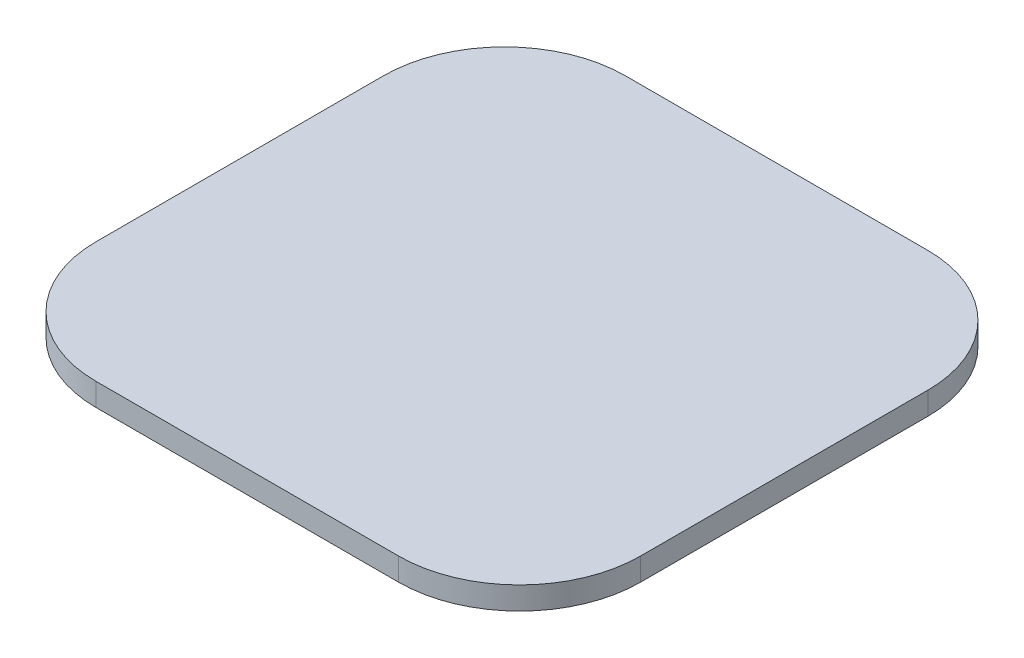
ISO-10303-21;
HEADER;
FILE_DESCRIPTION(('STEP AP214'),'2;1');
FILE_NAME('part.step','',(''),(''),'','','');
FILE_SCHEMA(('AUTOMOTIVE_DESIGN { 1 0 10303 214 1 1 1 1 }'));
ENDSEC;
DATA;
#1=APPLICATION_CONTEXT('core data for automotive mechanical design processes');
#2=APPLICATION_PROTOCOL_DEFINITION('international standard','automotive_design',2000,#1);
#3=PRODUCT_CONTEXT('',#1,'mechanical');
#4=PRODUCT('Part','Part','',(#3));
#5=PRODUCT_RELATED_PRODUCT_CATEGORY('part','',(#4));
#6=PRODUCT_DEFINITION_FORMATION('','',#4);
#7=PRODUCT_DEFINITION_CONTEXT('part definition',#1,'design');
#8=PRODUCT_DEFINITION('design','',#6,#7);
#9=PRODUCT_DEFINITION_SHAPE('','',#8);
#10=(LENGTH_UNIT() NAMED_UNIT(*) SI_UNIT(.MILLI.,.METRE.));
#11=(NAMED_UNIT(*) PLANE_ANGLE_UNIT() SI_UNIT($,.RADIAN.));
#12=(NAMED_UNIT(*) SI_UNIT($,.STERADIAN.) SOLID_ANGLE_UNIT());
#13=UNCERTAINTY_MEASURE_WITH_UNIT(LENGTH_MEASURE(1.E-05),#10,'distance_accuracy_value','');
#14=(GEOMETRIC_REPRESENTATION_CONTEXT(3) GLOBAL_UNCERTAINTY_ASSIGNED_CONTEXT((#13)) GLOBAL_UNIT_ASSIGNED_CONTEXT((#10,
#11,#12)) REPRESENTATION_CONTEXT('',''));
#15=CARTESIAN_POINT('',(0.,0.,0.));
#16=DIRECTION('',(0.,0.,1.));
#17=DIRECTION('',(1.,0.,0.));
#18=AXIS2_PLACEMENT_3D('',#15,#16,#17);
#19=CARTESIAN_POINT('',(0.,-7.5,0.));
#20=DIRECTION('',(0.,-1.,0.));
#21=DIRECTION('',(0.,0.,-1.));
#22=AXIS2_PLACEMENT_3D('',#19,#20,#21);
#23=PLANE('',#22);
#24=CARTESIAN_POINT('',(50.,-7.5,-4.99999999999996));
#25=DIRECTION('',(0.,1.,0.));
#26=DIRECTION('',(0.,0.,1.));
#27=AXIS2_PLACEMENT_3D('',#24,#25,#26);
#28=CIRCLE('',#27,40.);
#29=CARTESIAN_POINT('',(90.,-7.5,-4.99999999999996));
#30=VERTEX_POINT('',#29);
#31=CARTESIAN_POINT('',(49.9999999999999,-7.5,-45.));
#32=VERTEX_POINT('',#31);
#33=EDGE_CURVE('E11',#30,#32,#28,.T.);
#34=ORIENTED_EDGE('',*,*,#33,.T.);
#35=DIRECTION('',(1.,0.,0.));
#36=VECTOR('',#35,1.);
#37=CARTESIAN_POINT('',(-90.,-7.5,-44.9999999999999));
#38=LINE('',#37,#36);
#39=CARTESIAN_POINT('',(-50.,-7.5,-44.9999999999999));
#40=VERTEX_POINT('',#39);
#41=EDGE_CURVE('E136',#40,#32,#38,.T.);
#42=ORIENTED_EDGE('',*,*,#41,.F.);
#43=CARTESIAN_POINT('',(-50.,-7.5,-4.99999999999995));
#44=DIRECTION('',(0.,1.,0.));
#45=DIRECTION('',(0.,0.,1.));
#46=AXIS2_PLACEMENT_3D('',#43,#44,#45);
#47=CIRCLE('',#46,40.);
#48=CARTESIAN_POINT('',(-90.,-7.5,-4.99999999999994));
#49=VERTEX_POINT('',#48);
#50=EDGE_CURVE('E43',#40,#49,#47,.T.);
#51=ORIENTED_EDGE('',*,*,#50,.T.);
#52=DIRECTION('',(0.,0.,-1.));
#53=VECTOR('',#52,1.);
#54=CARTESIAN_POINT('',(-90.,-7.5,90.0000000000001));
#55=LINE('',#54,#53);
#56=CARTESIAN_POINT('',(-90.,-7.5,90.0000000000001));
#57=VERTEX_POINT('',#56);
#58=EDGE_CURVE('E57',#57,#49,#55,.T.);
#59=ORIENTED_EDGE('',*,*,#58,.F.);
#60=CARTESIAN_POINT('',(-50.,-7.5,90.0000000000001));
#61=DIRECTION('',(0.,-1.,0.));
#62=DIRECTION('',(0.,0.,-1.));
#63=AXIS2_PLACEMENT_3D('',#60,#61,#62);
#64=CIRCLE('',#63,40.);
#65=CARTESIAN_POINT('',(-50.,-7.5,130.));
#66=VERTEX_POINT('',#65);
#67=EDGE_CURVE('E154',#66,#57,#64,.T.);
#68=ORIENTED_EDGE('',*,*,#67,.F.);
#69=DIRECTION('',(-1.,0.,0.));
#70=VECTOR('',#69,1.);
#71=CARTESIAN_POINT('',(50.,-7.5,130.));
#72=LINE('',#71,#70);
#73=CARTESIAN_POINT('',(50.,-7.5,130.));
#74=VERTEX_POINT('',#73);
#75=EDGE_CURVE('E157',#74,#66,#72,.T.);
#76=ORIENTED_EDGE('',*,*,#75,.F.);
#77=CARTESIAN_POINT('',(50.,-7.5,90.0000000000001));
#78=DIRECTION('',(0.,-1.,0.));
#79=DIRECTION('',(0.,0.,-1.));
#80=AXIS2_PLACEMENT_3D('',#77,#78,#79);
#81=CIRCLE('',#80,40.);
#82=CARTESIAN_POINT('',(90.,-7.5,90.0000000000001));
#83=VERTEX_POINT('',#82);
#84=EDGE_CURVE('E106',#83,#74,#81,.T.);
#85=ORIENTED_EDGE('',*,*,#84,.F.);
#86=DIRECTION('',(0.,0.,1.));
#87=VECTOR('',#86,1.);
#88=CARTESIAN_POINT('',(90.,-7.5,-89.9999999999999));
#89=LINE('',#88,#87);
#90=EDGE_CURVE('E38',#30,#83,#89,.T.);
#91=ORIENTED_EDGE('',*,*,#90,.F.);
#92=EDGE_LOOP('',(#34,#42,#51,#59,#68,#76,#85,#91));
#93=FACE_BOUND('',#92,.T.);
#94=ADVANCED_FACE('F34',(#93),#23,.F.);
#95=CARTESIAN_POINT('',(-90.,-7.5,90.0000000000001));
#96=DIRECTION('',(1.,0.,0.));
#97=DIRECTION('',(0.,0.,-1.));
#98=AXIS2_PLACEMENT_3D('',#95,#96,#97);
#99=PLANE('',#98);
#100=DIRECTION('',(0.,1.,0.));
#101=VECTOR('',#100,1.);
#102=CARTESIAN_POINT('',(-90.,-7.5,90.0000000000001));
#103=LINE('',#102,#101);
#104=CARTESIAN_POINT('',(-90.,-15.,90.0000000000001));
#105=VERTEX_POINT('',#104);
#106=EDGE_CURVE('E150',#105,#57,#103,.T.);
#107=ORIENTED_EDGE('',*,*,#106,.T.);
#108=ORIENTED_EDGE('',*,*,#58,.T.);
#109=DIRECTION('',(0.,1.,0.));
#110=VECTOR('',#109,1.);
#111=CARTESIAN_POINT('',(-90.,-15.,-4.99999999999995));
#112=LINE('',#111,#110);
#113=CARTESIAN_POINT('',(-90.,-15.,-4.99999999999995));
#114=VERTEX_POINT('',#113);
#115=EDGE_CURVE('E122',#49,#114,#112,.F.);
#116=ORIENTED_EDGE('',*,*,#115,.T.);
#117=DIRECTION('',(0.,0.,-1.));
#118=VECTOR('',#117,1.);
#119=CARTESIAN_POINT('',(-90.,-15.,-44.9999999999999));
#120=LINE('',#119,#118);
#121=EDGE_CURVE('E137',#105,#114,#120,.T.);
#122=ORIENTED_EDGE('',*,*,#121,.F.);
#123=EDGE_LOOP('',(#107,#108,#116,#122));
#124=FACE_BOUND('',#123,.T.);
#125=ADVANCED_FACE('F166',(#124),#99,.F.);
#126=CARTESIAN_POINT('',(90.,-7.5,-89.9999999999999));
#127=DIRECTION('',(-1.,0.,0.));
#128=DIRECTION('',(0.,0.,1.));
#129=AXIS2_PLACEMENT_3D('',#126,#127,#128);
#130=PLANE('',#129);
#131=DIRECTION('',(0.,1.,0.));
#132=VECTOR('',#131,1.);
#133=CARTESIAN_POINT('',(90.,-15.,-4.99999999999996));
#134=LINE('',#133,#132);
#135=CARTESIAN_POINT('',(90.,-15.,-4.99999999999996));
#136=VERTEX_POINT('',#135);
#137=EDGE_CURVE('E127',#136,#30,#134,.T.);
#138=ORIENTED_EDGE('',*,*,#137,.T.);
#139=ORIENTED_EDGE('',*,*,#90,.T.);
#140=DIRECTION('',(0.,1.,0.));
#141=VECTOR('',#140,1.);
#142=CARTESIAN_POINT('',(90.,-7.5,90.0000000000001));
#143=LINE('',#142,#141);
#144=CARTESIAN_POINT('',(90.,-15.,90.0000000000001));
#145=VERTEX_POINT('',#144);
#146=EDGE_CURVE('E110',#145,#83,#143,.T.);
#147=ORIENTED_EDGE('',*,*,#146,.F.);
#148=DIRECTION('',(0.,0.,1.));
#149=VECTOR('',#148,1.);
#150=CARTESIAN_POINT('',(90.,-15.,-45.));
#151=LINE('',#150,#149);
#152=EDGE_CURVE('E121',#136,#145,#151,.T.);
#153=ORIENTED_EDGE('',*,*,#152,.F.);
#154=EDGE_LOOP('',(#138,#139,#147,#153));
#155=FACE_BOUND('',#154,.T.);
#156=ADVANCED_FACE('F36',(#155),#130,.F.);
#157=CARTESIAN_POINT('',(50.,-7.5,90.0000000000001));
#158=DIRECTION('',(0.,1.,0.));
#159=DIRECTION('',(0.,0.,1.));
#160=AXIS2_PLACEMENT_3D('',#157,#158,#159);
#161=CYLINDRICAL_SURFACE('',#160,40.);
#162=ORIENTED_EDGE('',*,*,#146,.T.);
#163=ORIENTED_EDGE('',*,*,#84,.T.);
#164=DIRECTION('',(0.,1.,0.));
#165=VECTOR('',#164,1.);
#166=CARTESIAN_POINT('',(50.,-7.5,130.));
#167=LINE('',#166,#165);
#168=CARTESIAN_POINT('',(49.9999999999999,-15.,130.));
#169=VERTEX_POINT('',#168);
#170=EDGE_CURVE('E101',#169,#74,#167,.T.);
#171=ORIENTED_EDGE('',*,*,#170,.F.);
#172=CARTESIAN_POINT('',(50.,-15.,90.0000000000001));
#173=DIRECTION('',(0.,1.,0.));
#174=DIRECTION('',(0.,0.,1.));
#175=AXIS2_PLACEMENT_3D('',#172,#173,#174);
#176=CIRCLE('',#175,40.);
#177=EDGE_CURVE('E105',#145,#169,#176,.F.);
#178=ORIENTED_EDGE('',*,*,#177,.F.);
#179=EDGE_LOOP('',(#162,#163,#171,#178));
#180=FACE_BOUND('',#179,.T.);
#181=ADVANCED_FACE('F104',(#180),#161,.T.);
#182=CARTESIAN_POINT('',(50.,-7.5,130.));
#183=DIRECTION('',(0.,0.,-1.));
#184=DIRECTION('',(-1.,0.,0.));
#185=AXIS2_PLACEMENT_3D('',#182,#183,#184);
#186=PLANE('',#185);
#187=ORIENTED_EDGE('',*,*,#170,.T.);
#188=ORIENTED_EDGE('',*,*,#75,.T.);
#189=DIRECTION('',(0.,1.,0.));
#190=VECTOR('',#189,1.);
#191=CARTESIAN_POINT('',(-50.,-7.5,130.));
#192=LINE('',#191,#190);
#193=CARTESIAN_POINT('',(-50.,-15.,130.));
#194=VERTEX_POINT('',#193);
#195=EDGE_CURVE('E111',#194,#66,#192,.T.);
#196=ORIENTED_EDGE('',*,*,#195,.F.);
#197=DIRECTION('',(-1.,0.,0.));
#198=VECTOR('',#197,1.);
#199=CARTESIAN_POINT('',(-90.,-15.,130.));
#200=LINE('',#199,#198);
#201=EDGE_CURVE('E118',#169,#194,#200,.T.);
#202=ORIENTED_EDGE('',*,*,#201,.F.);
#203=EDGE_LOOP('',(#187,#188,#196,#202));
#204=FACE_BOUND('',#203,.T.);
#205=ADVANCED_FACE('F125',(#204),#186,.F.);
#206=CARTESIAN_POINT('',(-50.,-7.5,90.0000000000001));
#207=DIRECTION('',(0.,1.,0.));
#208=DIRECTION('',(0.,0.,1.));
#209=AXIS2_PLACEMENT_3D('',#206,#207,#208);
#210=CYLINDRICAL_SURFACE('',#209,40.);
#211=ORIENTED_EDGE('',*,*,#195,.T.);
#212=ORIENTED_EDGE('',*,*,#67,.T.);
#213=ORIENTED_EDGE('',*,*,#106,.F.);
#214=CARTESIAN_POINT('',(-50.,-15.,90.0000000000001));
#215=DIRECTION('',(0.,1.,0.));
#216=DIRECTION('',(0.,0.,1.));
#217=AXIS2_PLACEMENT_3D('',#214,#215,#216);
#218=CIRCLE('',#217,40.);
#219=EDGE_CURVE('E123',#194,#105,#218,.F.);
#220=ORIENTED_EDGE('',*,*,#219,.F.);
#221=EDGE_LOOP('',(#211,#212,#213,#220));
#222=FACE_BOUND('',#221,.T.);
#223=ADVANCED_FACE('F162',(#222),#210,.T.);
#224=CARTESIAN_POINT('',(-90.,-15.,-44.9999999999999));
#225=DIRECTION('',(0.,0.,1.));
#226=DIRECTION('',(1.,0.,0.));
#227=AXIS2_PLACEMENT_3D('',#224,#225,#226);
#228=PLANE('',#227);
#229=DIRECTION('',(1.,0.,0.));
#230=VECTOR('',#229,1.);
#231=CARTESIAN_POINT('',(-90.,-15.,-44.9999999999999));
#232=LINE('',#231,#230);
#233=CARTESIAN_POINT('',(-50.,-15.,-44.9999999999999));
#234=VERTEX_POINT('',#233);
#235=CARTESIAN_POINT('',(49.9999999999999,-15.,-45.));
#236=VERTEX_POINT('',#235);
#237=EDGE_CURVE('E132',#234,#236,#232,.T.);
#238=ORIENTED_EDGE('',*,*,#237,.F.);
#239=DIRECTION('',(0.,1.,0.));
#240=VECTOR('',#239,1.);
#241=CARTESIAN_POINT('',(-50.,-15.,-44.9999999999999));
#242=LINE('',#241,#240);
#243=EDGE_CURVE('E147',#234,#40,#242,.T.);
#244=ORIENTED_EDGE('',*,*,#243,.T.);
#245=ORIENTED_EDGE('',*,*,#41,.T.);
#246=DIRECTION('',(0.,1.,0.));
#247=VECTOR('',#246,1.);
#248=CARTESIAN_POINT('',(50.,-15.,-45.));
#249=LINE('',#248,#247);
#250=EDGE_CURVE('E145',#32,#236,#249,.F.);
#251=ORIENTED_EDGE('',*,*,#250,.T.);
#252=EDGE_LOOP('',(#238,#244,#245,#251));
#253=FACE_BOUND('',#252,.T.);
#254=ADVANCED_FACE('F178',(#253),#228,.F.);
#255=CARTESIAN_POINT('',(0.,-15.,0.));
#256=DIRECTION('',(0.,1.,0.));
#257=DIRECTION('',(0.,0.,1.));
#258=AXIS2_PLACEMENT_3D('',#255,#256,#257);
#259=PLANE('',#258);
#260=ORIENTED_EDGE('',*,*,#152,.T.);
#261=ORIENTED_EDGE('',*,*,#177,.T.);
#262=ORIENTED_EDGE('',*,*,#201,.T.);
#263=ORIENTED_EDGE('',*,*,#219,.T.);
#264=ORIENTED_EDGE('',*,*,#121,.T.);
#265=CARTESIAN_POINT('',(-50.,-15.,-4.99999999999995));
#266=DIRECTION('',(0.,1.,0.));
#267=DIRECTION('',(0.,0.,1.));
#268=AXIS2_PLACEMENT_3D('',#265,#266,#267);
#269=CIRCLE('',#268,40.);
#270=EDGE_CURVE('E141',#114,#234,#269,.F.);
#271=ORIENTED_EDGE('',*,*,#270,.T.);
#272=ORIENTED_EDGE('',*,*,#237,.T.);
#273=CARTESIAN_POINT('',(50.,-15.,-4.99999999999996));
#274=DIRECTION('',(0.,1.,0.));
#275=DIRECTION('',(0.,0.,1.));
#276=AXIS2_PLACEMENT_3D('',#273,#274,#275);
#277=CIRCLE('',#276,40.);
#278=EDGE_CURVE('E130',#236,#136,#277,.F.);
#279=ORIENTED_EDGE('',*,*,#278,.T.);
#280=EDGE_LOOP('',(#260,#261,#262,#263,#264,#271,#272,#279));
#281=FACE_BOUND('',#280,.T.);
#282=ADVANCED_FACE('F116',(#281),#259,.F.);
#283=CARTESIAN_POINT('',(-50.,-15.,-4.99999999999995));
#284=DIRECTION('',(0.,1.,0.));
#285=DIRECTION('',(0.,0.,1.));
#286=AXIS2_PLACEMENT_3D('',#283,#284,#285);
#287=CYLINDRICAL_SURFACE('',#286,40.);
#288=ORIENTED_EDGE('',*,*,#270,.F.);
#289=ORIENTED_EDGE('',*,*,#115,.F.);
#290=ORIENTED_EDGE('',*,*,#50,.F.);
#291=ORIENTED_EDGE('',*,*,#243,.F.);
#292=EDGE_LOOP('',(#288,#289,#290,#291));
#293=FACE_BOUND('',#292,.T.);
#294=ADVANCED_FACE('F180',(#293),#287,.T.);
#295=CARTESIAN_POINT('',(50.,-15.,-4.99999999999996));
#296=DIRECTION('',(0.,1.,0.));
#297=DIRECTION('',(0.,0.,1.));
#298=AXIS2_PLACEMENT_3D('',#295,#296,#297);
#299=CYLINDRICAL_SURFACE('',#298,40.);
#300=ORIENTED_EDGE('',*,*,#278,.F.);
#301=ORIENTED_EDGE('',*,*,#250,.F.);
#302=ORIENTED_EDGE('',*,*,#33,.F.);
#303=ORIENTED_EDGE('',*,*,#137,.F.);
#304=EDGE_LOOP('',(#300,#301,#302,#303));
#305=FACE_BOUND('',#304,.T.);
#306=ADVANCED_FACE('F176',(#305),#299,.T.);
#307=CLOSED_SHELL('',(#94,#125,#156,#181,#205,#223,#254,#282,#294,#306));
#308=MANIFOLD_SOLID_BREP('B2',#307);
#309=ADVANCED_BREP_SHAPE_REPRESENTATION('',(#18,#308),#14);
#310=SHAPE_DEFINITION_REPRESENTATION(#9,#309);
ENDSEC;
END-ISO-10303-21;
